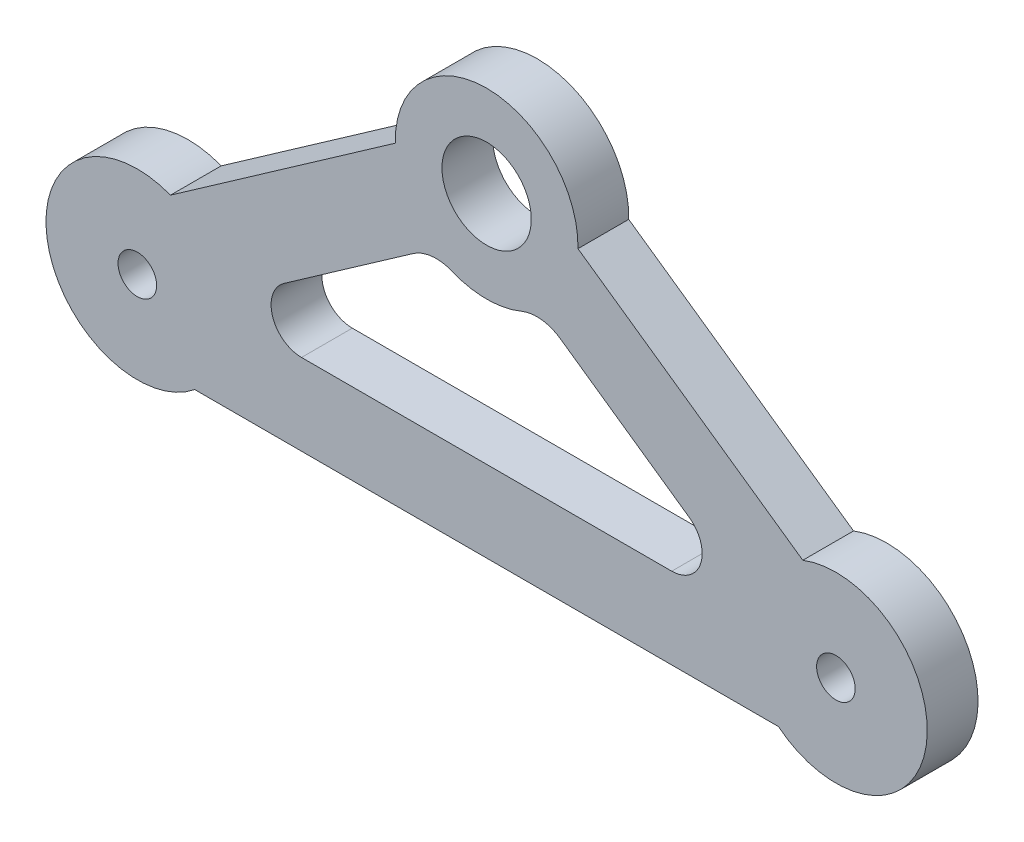
ISO-10303-21;
HEADER;
FILE_DESCRIPTION(('STEP AP214'),'2;1');
FILE_NAME('part.step','',(''),(''),'','','');
FILE_SCHEMA(('AUTOMOTIVE_DESIGN { 1 0 10303 214 1 1 1 1 }'));
ENDSEC;
DATA;
#1=APPLICATION_CONTEXT('core data for automotive mechanical design processes');
#2=APPLICATION_PROTOCOL_DEFINITION('international standard','automotive_design',2000,#1);
#3=PRODUCT_CONTEXT('',#1,'mechanical');
#4=PRODUCT('Part','Part','',(#3));
#5=PRODUCT_RELATED_PRODUCT_CATEGORY('part','',(#4));
#6=PRODUCT_DEFINITION_FORMATION('','',#4);
#7=PRODUCT_DEFINITION_CONTEXT('part definition',#1,'design');
#8=PRODUCT_DEFINITION('design','',#6,#7);
#9=PRODUCT_DEFINITION_SHAPE('','',#8);
#10=(LENGTH_UNIT() NAMED_UNIT(*) SI_UNIT(.MILLI.,.METRE.));
#11=(NAMED_UNIT(*) PLANE_ANGLE_UNIT() SI_UNIT($,.RADIAN.));
#12=(NAMED_UNIT(*) SI_UNIT($,.STERADIAN.) SOLID_ANGLE_UNIT());
#13=UNCERTAINTY_MEASURE_WITH_UNIT(LENGTH_MEASURE(1.E-05),#10,'distance_accuracy_value','');
#14=(GEOMETRIC_REPRESENTATION_CONTEXT(3) GLOBAL_UNCERTAINTY_ASSIGNED_CONTEXT((#13)) GLOBAL_UNIT_ASSIGNED_CONTEXT((#10,
#11,#12)) REPRESENTATION_CONTEXT('',''));
#15=CARTESIAN_POINT('',(0.,0.,0.));
#16=DIRECTION('',(0.,0.,1.));
#17=DIRECTION('',(1.,0.,0.));
#18=AXIS2_PLACEMENT_3D('',#15,#16,#17);
#19=CARTESIAN_POINT('',(34.4043858601376,0.,5.));
#20=DIRECTION('',(0.,0.,1.));
#21=DIRECTION('',(1.,0.,0.));
#22=AXIS2_PLACEMENT_3D('',#19,#20,#21);
#23=PLANE('',#22);
#24=CARTESIAN_POINT('',(34.4043858601376,0.,5.));
#25=DIRECTION('',(0.,0.,-1.));
#26=DIRECTION('',(-1.,0.,0.));
#27=AXIS2_PLACEMENT_3D('',#24,#25,#26);
#28=CIRCLE('',#27,1.89999999999999);
#29=CARTESIAN_POINT('',(32.5043858601376,0.,5.));
#30=VERTEX_POINT('',#29);
#31=EDGE_CURVE('E232',#30,#30,#28,.T.);
#32=ORIENTED_EDGE('',*,*,#31,.T.);
#33=EDGE_LOOP('',(#32));
#34=FACE_BOUND('',#33,.T.);
#35=CARTESIAN_POINT('',(0.,24.090210326744,5.));
#36=DIRECTION('',(0.,0.,-1.));
#37=DIRECTION('',(-1.,0.,0.));
#38=AXIS2_PLACEMENT_3D('',#35,#36,#37);
#39=CIRCLE('',#38,4.4);
#40=CARTESIAN_POINT('',(-4.4,24.090210326744,5.));
#41=VERTEX_POINT('',#40);
#42=EDGE_CURVE('E163',#41,#41,#39,.T.);
#43=ORIENTED_EDGE('',*,*,#42,.T.);
#44=EDGE_LOOP('',(#43));
#45=FACE_BOUND('',#44,.T.);
#46=CARTESIAN_POINT('',(-34.4043858601376,0.,5.));
#47=DIRECTION('',(0.,0.,-1.));
#48=DIRECTION('',(-1.,0.,0.));
#49=AXIS2_PLACEMENT_3D('',#46,#47,#48);
#50=CIRCLE('',#49,9.);
#51=CARTESIAN_POINT('',(-28.7475316106452,-7.,5.));
#52=VERTEX_POINT('',#51);
#53=CARTESIAN_POINT('',(-31.1422954470831,8.38801324134969,5.));
#54=VERTEX_POINT('',#53);
#55=EDGE_CURVE('E170',#52,#54,#50,.T.);
#56=ORIENTED_EDGE('',*,*,#55,.F.);
#57=DIRECTION('',(1.,0.,0.));
#58=VECTOR('',#57,1.);
#59=CARTESIAN_POINT('',(-28.7475316106452,-7.,5.));
#60=LINE('',#59,#58);
#61=CARTESIAN_POINT('',(28.7475316106453,-7.,5.));
#62=VERTEX_POINT('',#61);
#63=EDGE_CURVE('E166',#52,#62,#60,.T.);
#64=ORIENTED_EDGE('',*,*,#63,.T.);
#65=CARTESIAN_POINT('',(34.4043858601376,0.,5.));
#66=DIRECTION('',(0.,0.,-1.));
#67=DIRECTION('',(-1.,0.,0.));
#68=AXIS2_PLACEMENT_3D('',#65,#66,#67);
#69=CIRCLE('',#68,8.99999999999999);
#70=CARTESIAN_POINT('',(31.1422954470831,8.38801324134969,5.));
#71=VERTEX_POINT('',#70);
#72=EDGE_CURVE('E164',#71,#62,#69,.T.);
#73=ORIENTED_EDGE('',*,*,#72,.F.);
#74=DIRECTION('',(0.819152044288991,-0.573576436351047,0.));
#75=VECTOR('',#74,1.);
#76=CARTESIAN_POINT('',(8.99785477656499,23.8937175282842,5.));
#77=LINE('',#76,#75);
#78=CARTESIAN_POINT('',(8.99785477656499,23.8937175282842,5.));
#79=VERTEX_POINT('',#78);
#80=EDGE_CURVE('E136',#71,#79,#77,.F.);
#81=ORIENTED_EDGE('',*,*,#80,.T.);
#82=CARTESIAN_POINT('',(0.,24.090210326744,5.));
#83=DIRECTION('',(0.,0.,-1.));
#84=DIRECTION('',(-1.,0.,0.));
#85=AXIS2_PLACEMENT_3D('',#82,#83,#84);
#86=CIRCLE('',#85,9.00000000000001);
#87=CARTESIAN_POINT('',(-8.997854776565,23.8937175282842,5.));
#88=VERTEX_POINT('',#87);
#89=EDGE_CURVE('E133',#88,#79,#86,.T.);
#90=ORIENTED_EDGE('',*,*,#89,.F.);
#91=DIRECTION('',(0.819152044288991,0.573576436351047,0.));
#92=VECTOR('',#91,1.);
#93=CARTESIAN_POINT('',(-8.99785477656499,23.8937175282842,5.));
#94=LINE('',#93,#92);
#95=EDGE_CURVE('E173',#88,#54,#94,.F.);
#96=ORIENTED_EDGE('',*,*,#95,.T.);
#97=EDGE_LOOP('',(#56,#64,#73,#81,#90,#96));
#98=FACE_BOUND('',#97,.T.);
#99=CARTESIAN_POINT('',(-34.4043858601376,0.,5.));
#100=DIRECTION('',(0.,0.,-1.));
#101=DIRECTION('',(-1.,0.,0.));
#102=AXIS2_PLACEMENT_3D('',#99,#100,#101);
#103=CIRCLE('',#102,1.9);
#104=CARTESIAN_POINT('',(-36.3043858601376,0.,5.));
#105=VERTEX_POINT('',#104);
#106=EDGE_CURVE('E178',#105,#105,#103,.T.);
#107=ORIENTED_EDGE('',*,*,#106,.T.);
#108=EDGE_LOOP('',(#107));
#109=FACE_BOUND('',#108,.T.);
#110=DIRECTION('',(-0.819152044288991,0.573576436351047,0.));
#111=VECTOR('',#110,1.);
#112=CARTESIAN_POINT('',(27.7458974665322,1.,5.));
#113=LINE('',#112,#111);
#114=CARTESIAN_POINT('',(7.25263174461788,15.3495391410191,5.));
#115=VERTEX_POINT('',#114);
#116=CARTESIAN_POINT('',(19.9518423684957,6.45745613286697,5.));
#117=VERTEX_POINT('',#116);
#118=EDGE_CURVE('E203',#115,#117,#113,.F.);
#119=ORIENTED_EDGE('',*,*,#118,.T.);
#120=CARTESIAN_POINT('',(18.2311130594426,4.,5.));
#121=DIRECTION('',(0.,0.,-1.));
#122=DIRECTION('',(-1.,0.,0.));
#123=AXIS2_PLACEMENT_3D('',#120,#121,#122);
#124=CIRCLE('',#123,3.);
#125=CARTESIAN_POINT('',(18.2311130594426,1.,5.));
#126=VERTEX_POINT('',#125);
#127=EDGE_CURVE('E199',#117,#126,#124,.T.);
#128=ORIENTED_EDGE('',*,*,#127,.T.);
#129=DIRECTION('',(1.,0.,0.));
#130=VECTOR('',#129,1.);
#131=CARTESIAN_POINT('',(-27.7458974665322,1.,5.));
#132=LINE('',#131,#130);
#133=CARTESIAN_POINT('',(-18.2311130594426,1.,5.));
#134=VERTEX_POINT('',#133);
#135=EDGE_CURVE('E195',#126,#134,#132,.F.);
#136=ORIENTED_EDGE('',*,*,#135,.T.);
#137=CARTESIAN_POINT('',(-18.2311130594426,4.,5.));
#138=DIRECTION('',(0.,0.,-1.));
#139=DIRECTION('',(-1.,0.,0.));
#140=AXIS2_PLACEMENT_3D('',#137,#138,#139);
#141=CIRCLE('',#140,3.);
#142=CARTESIAN_POINT('',(-19.9518423684958,6.45745613286697,5.));
#143=VERTEX_POINT('',#142);
#144=EDGE_CURVE('E191',#134,#143,#141,.T.);
#145=ORIENTED_EDGE('',*,*,#144,.T.);
#146=DIRECTION('',(-0.819152044288991,-0.573576436351047,0.));
#147=VECTOR('',#146,1.);
#148=CARTESIAN_POINT('',(-5.23000627502169,16.7657967418053,5.));
#149=LINE('',#148,#147);
#150=CARTESIAN_POINT('',(-7.2526317446179,15.3495391410191,5.));
#151=VERTEX_POINT('',#150);
#152=EDGE_CURVE('E187',#143,#151,#149,.F.);
#153=ORIENTED_EDGE('',*,*,#152,.T.);
#154=CARTESIAN_POINT('',(-4.95832599921371,12.0729309638632,5.));
#155=DIRECTION('',(0.,0.,1.));
#156=DIRECTION('',(1.,0.,0.));
#157=AXIS2_PLACEMENT_3D('',#154,#155,#156);
#158=CIRCLE('',#157,4.);
#159=CARTESIAN_POINT('',(-3.43268723022488,15.7705553832111,5.));
#160=VERTEX_POINT('',#159);
#161=EDGE_CURVE('E183',#151,#160,#158,.F.);
#162=ORIENTED_EDGE('',*,*,#161,.T.);
#163=CARTESIAN_POINT('',(0.,24.090210326744,5.));
#164=DIRECTION('',(0.,0.,1.));
#165=DIRECTION('',(1.,0.,0.));
#166=AXIS2_PLACEMENT_3D('',#163,#164,#165);
#167=CIRCLE('',#166,9.00000000000001);
#168=CARTESIAN_POINT('',(3.43268723022486,15.7705553832111,5.));
#169=VERTEX_POINT('',#168);
#170=EDGE_CURVE('E179',#169,#160,#167,.F.);
#171=ORIENTED_EDGE('',*,*,#170,.F.);
#172=CARTESIAN_POINT('',(4.95832599921369,12.0729309638631,5.));
#173=DIRECTION('',(0.,0.,1.));
#174=DIRECTION('',(1.,0.,0.));
#175=AXIS2_PLACEMENT_3D('',#172,#173,#174);
#176=CIRCLE('',#175,4.);
#177=EDGE_CURVE('E20',#169,#115,#176,.F.);
#178=ORIENTED_EDGE('',*,*,#177,.T.);
#179=EDGE_LOOP('',(#119,#128,#136,#145,#153,#162,#171,#178));
#180=FACE_BOUND('',#179,.T.);
#181=ADVANCED_FACE('F17',(#34,#45,#98,#109,#180),#23,.T.);
#182=CARTESIAN_POINT('',(4.95832599921369,12.0729309638631,-2.));
#183=DIRECTION('',(0.,0.,1.));
#184=DIRECTION('',(1.,0.,0.));
#185=AXIS2_PLACEMENT_3D('',#182,#183,#184);
#186=CYLINDRICAL_SURFACE('',#185,4.);
#187=DIRECTION('',(0.,0.,1.));
#188=VECTOR('',#187,1.);
#189=CARTESIAN_POINT('',(7.25263174461788,15.3495391410191,-2.));
#190=LINE('',#189,#188);
#191=CARTESIAN_POINT('',(7.25263174461788,15.3495391410191,0.));
#192=VERTEX_POINT('',#191);
#193=EDGE_CURVE('E204',#192,#115,#190,.T.);
#194=ORIENTED_EDGE('',*,*,#193,.T.);
#195=ORIENTED_EDGE('',*,*,#177,.F.);
#196=DIRECTION('',(0.,0.,1.));
#197=VECTOR('',#196,1.);
#198=CARTESIAN_POINT('',(3.43268723022486,15.7705553832111,-2.));
#199=LINE('',#198,#197);
#200=CARTESIAN_POINT('',(3.43268723022486,15.7705553832111,0.));
#201=VERTEX_POINT('',#200);
#202=EDGE_CURVE('E180',#201,#169,#199,.T.);
#203=ORIENTED_EDGE('',*,*,#202,.F.);
#204=CARTESIAN_POINT('',(4.95832599921369,12.0729309638631,0.));
#205=DIRECTION('',(0.,0.,1.));
#206=DIRECTION('',(1.,0.,0.));
#207=AXIS2_PLACEMENT_3D('',#204,#205,#206);
#208=CIRCLE('',#207,4.);
#209=EDGE_CURVE('E161',#201,#192,#208,.F.);
#210=ORIENTED_EDGE('',*,*,#209,.T.);
#211=EDGE_LOOP('',(#194,#195,#203,#210));
#212=FACE_BOUND('',#211,.T.);
#213=ADVANCED_FACE('F262',(#212),#186,.F.);
#214=CARTESIAN_POINT('',(27.7458974665322,1.,-2.));
#215=DIRECTION('',(0.573576436351047,0.819152044288991,0.));
#216=DIRECTION('',(-0.819152044288991,0.573576436351047,0.));
#217=AXIS2_PLACEMENT_3D('',#214,#215,#216);
#218=PLANE('',#217);
#219=ORIENTED_EDGE('',*,*,#193,.F.);
#220=DIRECTION('',(0.819152044288991,-0.573576436351047,0.));
#221=VECTOR('',#220,1.);
#222=CARTESIAN_POINT('',(7.25263174461788,15.3495391410191,0.));
#223=LINE('',#222,#221);
#224=CARTESIAN_POINT('',(19.9518423684957,6.45745613286698,0.));
#225=VERTEX_POINT('',#224);
#226=EDGE_CURVE('E158',#192,#225,#223,.T.);
#227=ORIENTED_EDGE('',*,*,#226,.T.);
#228=DIRECTION('',(0.,0.,-1.));
#229=VECTOR('',#228,1.);
#230=CARTESIAN_POINT('',(19.9518423684957,6.45745613286697,-2.));
#231=LINE('',#230,#229);
#232=EDGE_CURVE('E200',#225,#117,#231,.F.);
#233=ORIENTED_EDGE('',*,*,#232,.T.);
#234=ORIENTED_EDGE('',*,*,#118,.F.);
#235=EDGE_LOOP('',(#219,#227,#233,#234));
#236=FACE_BOUND('',#235,.T.);
#237=ADVANCED_FACE('F260',(#236),#218,.F.);
#238=CARTESIAN_POINT('',(18.2311130594426,4.,-2.));
#239=DIRECTION('',(0.,0.,-1.));
#240=DIRECTION('',(-1.,0.,0.));
#241=AXIS2_PLACEMENT_3D('',#238,#239,#240);
#242=CYLINDRICAL_SURFACE('',#241,3.);
#243=DIRECTION('',(0.,0.,-1.));
#244=VECTOR('',#243,1.);
#245=CARTESIAN_POINT('',(18.2311130594426,1.,-2.));
#246=LINE('',#245,#244);
#247=CARTESIAN_POINT('',(18.2311130594426,1.,0.));
#248=VERTEX_POINT('',#247);
#249=EDGE_CURVE('E196',#248,#126,#246,.F.);
#250=ORIENTED_EDGE('',*,*,#249,.T.);
#251=ORIENTED_EDGE('',*,*,#127,.F.);
#252=ORIENTED_EDGE('',*,*,#232,.F.);
#253=CARTESIAN_POINT('',(18.2311130594426,4.,0.));
#254=DIRECTION('',(0.,0.,-1.));
#255=DIRECTION('',(-1.,0.,0.));
#256=AXIS2_PLACEMENT_3D('',#253,#254,#255);
#257=CIRCLE('',#256,3.);
#258=EDGE_CURVE('E157',#225,#248,#257,.T.);
#259=ORIENTED_EDGE('',*,*,#258,.T.);
#260=EDGE_LOOP('',(#250,#251,#252,#259));
#261=FACE_BOUND('',#260,.T.);
#262=ADVANCED_FACE('F253',(#261),#242,.F.);
#263=CARTESIAN_POINT('',(-27.7458974665322,1.,-2.));
#264=DIRECTION('',(0.,-1.,0.));
#265=DIRECTION('',(0.,0.,-1.));
#266=AXIS2_PLACEMENT_3D('',#263,#264,#265);
#267=PLANE('',#266);
#268=ORIENTED_EDGE('',*,*,#249,.F.);
#269=DIRECTION('',(1.,0.,0.));
#270=VECTOR('',#269,1.);
#271=CARTESIAN_POINT('',(34.4043858601376,1.,0.));
#272=LINE('',#271,#270);
#273=CARTESIAN_POINT('',(-18.2311130594426,1.,0.));
#274=VERTEX_POINT('',#273);
#275=EDGE_CURVE('E154',#248,#274,#272,.F.);
#276=ORIENTED_EDGE('',*,*,#275,.T.);
#277=DIRECTION('',(0.,0.,-1.));
#278=VECTOR('',#277,1.);
#279=CARTESIAN_POINT('',(-18.2311130594426,1.,-2.));
#280=LINE('',#279,#278);
#281=EDGE_CURVE('E192',#274,#134,#280,.F.);
#282=ORIENTED_EDGE('',*,*,#281,.T.);
#283=ORIENTED_EDGE('',*,*,#135,.F.);
#284=EDGE_LOOP('',(#268,#276,#282,#283));
#285=FACE_BOUND('',#284,.T.);
#286=ADVANCED_FACE('F251',(#285),#267,.F.);
#287=CARTESIAN_POINT('',(-18.2311130594426,4.,-2.));
#288=DIRECTION('',(0.,0.,-1.));
#289=DIRECTION('',(-1.,0.,0.));
#290=AXIS2_PLACEMENT_3D('',#287,#288,#289);
#291=CYLINDRICAL_SURFACE('',#290,3.);
#292=ORIENTED_EDGE('',*,*,#144,.F.);
#293=ORIENTED_EDGE('',*,*,#281,.F.);
#294=CARTESIAN_POINT('',(-18.2311130594426,4.,0.));
#295=DIRECTION('',(0.,0.,-1.));
#296=DIRECTION('',(-1.,0.,0.));
#297=AXIS2_PLACEMENT_3D('',#294,#295,#296);
#298=CIRCLE('',#297,3.);
#299=CARTESIAN_POINT('',(-19.9518423684958,6.45745613286697,0.));
#300=VERTEX_POINT('',#299);
#301=EDGE_CURVE('E153',#274,#300,#298,.T.);
#302=ORIENTED_EDGE('',*,*,#301,.T.);
#303=DIRECTION('',(0.,0.,1.));
#304=VECTOR('',#303,1.);
#305=CARTESIAN_POINT('',(-19.9518423684958,6.45745613286697,-2.));
#306=LINE('',#305,#304);
#307=EDGE_CURVE('E188',#300,#143,#306,.T.);
#308=ORIENTED_EDGE('',*,*,#307,.T.);
#309=EDGE_LOOP('',(#292,#293,#302,#308));
#310=FACE_BOUND('',#309,.T.);
#311=ADVANCED_FACE('F276',(#310),#291,.F.);
#312=CARTESIAN_POINT('',(-5.23000627502169,16.7657967418053,-2.));
#313=DIRECTION('',(-0.573576436351047,0.819152044288991,0.));
#314=DIRECTION('',(-0.819152044288991,-0.573576436351047,0.));
#315=AXIS2_PLACEMENT_3D('',#312,#313,#314);
#316=PLANE('',#315);
#317=DIRECTION('',(0.,0.,1.));
#318=VECTOR('',#317,1.);
#319=CARTESIAN_POINT('',(-7.2526317446179,15.3495391410191,-2.));
#320=LINE('',#319,#318);
#321=CARTESIAN_POINT('',(-7.2526317446179,15.3495391410191,0.));
#322=VERTEX_POINT('',#321);
#323=EDGE_CURVE('E184',#322,#151,#320,.T.);
#324=ORIENTED_EDGE('',*,*,#323,.T.);
#325=ORIENTED_EDGE('',*,*,#152,.F.);
#326=ORIENTED_EDGE('',*,*,#307,.F.);
#327=DIRECTION('',(0.819152044288991,0.573576436351047,0.));
#328=VECTOR('',#327,1.);
#329=CARTESIAN_POINT('',(-19.9518423684958,6.45745613286697,0.));
#330=LINE('',#329,#328);
#331=EDGE_CURVE('E149',#300,#322,#330,.T.);
#332=ORIENTED_EDGE('',*,*,#331,.T.);
#333=EDGE_LOOP('',(#324,#325,#326,#332));
#334=FACE_BOUND('',#333,.T.);
#335=ADVANCED_FACE('F273',(#334),#316,.F.);
#336=CARTESIAN_POINT('',(-4.95832599921371,12.0729309638632,-2.));
#337=DIRECTION('',(0.,0.,1.));
#338=DIRECTION('',(1.,0.,0.));
#339=AXIS2_PLACEMENT_3D('',#336,#337,#338);
#340=CYLINDRICAL_SURFACE('',#339,4.);
#341=DIRECTION('',(0.,0.,1.));
#342=VECTOR('',#341,1.);
#343=CARTESIAN_POINT('',(-3.43268723022488,15.7705553832111,-2.));
#344=LINE('',#343,#342);
#345=CARTESIAN_POINT('',(-3.43268723022488,15.7705553832111,0.));
#346=VERTEX_POINT('',#345);
#347=EDGE_CURVE('E176',#160,#346,#344,.F.);
#348=ORIENTED_EDGE('',*,*,#347,.F.);
#349=ORIENTED_EDGE('',*,*,#161,.F.);
#350=ORIENTED_EDGE('',*,*,#323,.F.);
#351=CARTESIAN_POINT('',(-4.95832599921371,12.0729309638632,0.));
#352=DIRECTION('',(0.,0.,1.));
#353=DIRECTION('',(1.,0.,0.));
#354=AXIS2_PLACEMENT_3D('',#351,#352,#353);
#355=CIRCLE('',#354,4.);
#356=EDGE_CURVE('E152',#322,#346,#355,.F.);
#357=ORIENTED_EDGE('',*,*,#356,.T.);
#358=EDGE_LOOP('',(#348,#349,#350,#357));
#359=FACE_BOUND('',#358,.T.);
#360=ADVANCED_FACE('F269',(#359),#340,.F.);
#361=CARTESIAN_POINT('',(0.,24.090210326744,-2.));
#362=DIRECTION('',(0.,0.,1.));
#363=DIRECTION('',(1.,0.,0.));
#364=AXIS2_PLACEMENT_3D('',#361,#362,#363);
#365=CYLINDRICAL_SURFACE('',#364,9.00000000000001);
#366=ORIENTED_EDGE('',*,*,#170,.T.);
#367=ORIENTED_EDGE('',*,*,#347,.T.);
#368=CARTESIAN_POINT('',(0.,24.090210326744,0.));
#369=DIRECTION('',(0.,0.,1.));
#370=DIRECTION('',(1.,0.,0.));
#371=AXIS2_PLACEMENT_3D('',#368,#369,#370);
#372=CIRCLE('',#371,9.00000000000001);
#373=EDGE_CURVE('E144',#346,#201,#372,.T.);
#374=ORIENTED_EDGE('',*,*,#373,.T.);
#375=ORIENTED_EDGE('',*,*,#202,.T.);
#376=EDGE_LOOP('',(#366,#367,#374,#375));
#377=FACE_BOUND('',#376,.T.);
#378=ADVANCED_FACE('F278',(#377),#365,.T.);
#379=CARTESIAN_POINT('',(-34.4043858601376,0.,5.));
#380=DIRECTION('',(0.,0.,-1.));
#381=DIRECTION('',(-1.,0.,0.));
#382=AXIS2_PLACEMENT_3D('',#379,#380,#381);
#383=CYLINDRICAL_SURFACE('',#382,1.9);
#384=CARTESIAN_POINT('',(-34.4043858601376,0.,0.));
#385=DIRECTION('',(0.,0.,-1.));
#386=DIRECTION('',(-1.,0.,0.));
#387=AXIS2_PLACEMENT_3D('',#384,#385,#386);
#388=CIRCLE('',#387,1.9);
#389=CARTESIAN_POINT('',(-36.3043858601376,0.,0.));
#390=VERTEX_POINT('',#389);
#391=EDGE_CURVE('E141',#390,#390,#388,.T.);
#392=ORIENTED_EDGE('',*,*,#391,.T.);
#393=EDGE_LOOP('',(#392));
#394=FACE_BOUND('',#393,.T.);
#395=ORIENTED_EDGE('',*,*,#106,.F.);
#396=EDGE_LOOP('',(#395));
#397=FACE_BOUND('',#396,.T.);
#398=ADVANCED_FACE('F280',(#394,#397),#383,.F.);
#399=CARTESIAN_POINT('',(8.99785477656499,23.8937175282842,5.));
#400=DIRECTION('',(-0.573576436351047,-0.819152044288991,0.));
#401=DIRECTION('',(0.819152044288991,-0.573576436351047,0.));
#402=AXIS2_PLACEMENT_3D('',#399,#400,#401);
#403=PLANE('',#402);
#404=DIRECTION('',(0.,0.,1.));
#405=VECTOR('',#404,1.);
#406=CARTESIAN_POINT('',(8.99785477656499,23.8937175282842,5.));
#407=LINE('',#406,#405);
#408=CARTESIAN_POINT('',(8.99785477656499,23.8937175282842,0.));
#409=VERTEX_POINT('',#408);
#410=EDGE_CURVE('E131',#79,#409,#407,.F.);
#411=ORIENTED_EDGE('',*,*,#410,.F.);
#412=ORIENTED_EDGE('',*,*,#80,.F.);
#413=DIRECTION('',(0.,0.,-1.));
#414=VECTOR('',#413,1.);
#415=CARTESIAN_POINT('',(31.1422954470831,8.38801324134969,5.));
#416=LINE('',#415,#414);
#417=CARTESIAN_POINT('',(31.1422954470831,8.38801324134969,0.));
#418=VERTEX_POINT('',#417);
#419=EDGE_CURVE('E140',#418,#71,#416,.F.);
#420=ORIENTED_EDGE('',*,*,#419,.F.);
#421=DIRECTION('',(-0.819152044288991,0.573576436351047,0.));
#422=VECTOR('',#421,1.);
#423=CARTESIAN_POINT('',(31.1422954470831,8.38801324134969,0.));
#424=LINE('',#423,#422);
#425=EDGE_CURVE('E124',#418,#409,#424,.T.);
#426=ORIENTED_EDGE('',*,*,#425,.T.);
#427=EDGE_LOOP('',(#411,#412,#420,#426));
#428=FACE_BOUND('',#427,.T.);
#429=ADVANCED_FACE('F138',(#428),#403,.F.);
#430=CARTESIAN_POINT('',(0.,24.090210326744,5.));
#431=DIRECTION('',(0.,0.,-1.));
#432=DIRECTION('',(-1.,0.,0.));
#433=AXIS2_PLACEMENT_3D('',#430,#431,#432);
#434=CYLINDRICAL_SURFACE('',#433,9.00000000000001);
#435=CARTESIAN_POINT('',(0.,24.090210326744,0.));
#436=DIRECTION('',(0.,0.,-1.));
#437=DIRECTION('',(-1.,0.,0.));
#438=AXIS2_PLACEMENT_3D('',#435,#436,#437);
#439=CIRCLE('',#438,9.00000000000001);
#440=CARTESIAN_POINT('',(-8.997854776565,23.8937175282842,0.));
#441=VERTEX_POINT('',#440);
#442=EDGE_CURVE('E116',#409,#441,#439,.F.);
#443=ORIENTED_EDGE('',*,*,#442,.T.);
#444=DIRECTION('',(0.,0.,1.));
#445=VECTOR('',#444,1.);
#446=CARTESIAN_POINT('',(-8.99785477656499,23.8937175282842,5.));
#447=LINE('',#446,#445);
#448=EDGE_CURVE('E174',#441,#88,#447,.T.);
#449=ORIENTED_EDGE('',*,*,#448,.T.);
#450=ORIENTED_EDGE('',*,*,#89,.T.);
#451=ORIENTED_EDGE('',*,*,#410,.T.);
#452=EDGE_LOOP('',(#443,#449,#450,#451));
#453=FACE_BOUND('',#452,.T.);
#454=ADVANCED_FACE('F132',(#453),#434,.T.);
#455=CARTESIAN_POINT('',(-8.99785477656499,23.8937175282842,5.));
#456=DIRECTION('',(0.573576436351047,-0.819152044288991,0.));
#457=DIRECTION('',(0.819152044288991,0.573576436351047,0.));
#458=AXIS2_PLACEMENT_3D('',#455,#456,#457);
#459=PLANE('',#458);
#460=DIRECTION('',(0.,0.,-1.));
#461=VECTOR('',#460,1.);
#462=CARTESIAN_POINT('',(-31.1422954470831,8.38801324134969,5.));
#463=LINE('',#462,#461);
#464=CARTESIAN_POINT('',(-31.1422954470831,8.38801324134969,0.));
#465=VERTEX_POINT('',#464);
#466=EDGE_CURVE('E171',#54,#465,#463,.T.);
#467=ORIENTED_EDGE('',*,*,#466,.F.);
#468=ORIENTED_EDGE('',*,*,#95,.F.);
#469=ORIENTED_EDGE('',*,*,#448,.F.);
#470=DIRECTION('',(-0.819152044288991,-0.573576436351047,0.));
#471=VECTOR('',#470,1.);
#472=CARTESIAN_POINT('',(-8.99785477656499,23.8937175282842,0.));
#473=LINE('',#472,#471);
#474=EDGE_CURVE('E128',#441,#465,#473,.T.);
#475=ORIENTED_EDGE('',*,*,#474,.T.);
#476=EDGE_LOOP('',(#467,#468,#469,#475));
#477=FACE_BOUND('',#476,.T.);
#478=ADVANCED_FACE('F316',(#477),#459,.F.);
#479=CARTESIAN_POINT('',(-34.4043858601376,0.,5.));
#480=DIRECTION('',(0.,0.,-1.));
#481=DIRECTION('',(-1.,0.,0.));
#482=AXIS2_PLACEMENT_3D('',#479,#480,#481);
#483=CYLINDRICAL_SURFACE('',#482,9.);
#484=CARTESIAN_POINT('',(-34.4043858601376,0.,0.));
#485=DIRECTION('',(0.,0.,-1.));
#486=DIRECTION('',(-1.,0.,0.));
#487=AXIS2_PLACEMENT_3D('',#484,#485,#486);
#488=CIRCLE('',#487,9.);
#489=CARTESIAN_POINT('',(-28.7475316106452,-7.,0.));
#490=VERTEX_POINT('',#489);
#491=EDGE_CURVE('E221',#465,#490,#488,.F.);
#492=ORIENTED_EDGE('',*,*,#491,.T.);
#493=DIRECTION('',(0.,0.,1.));
#494=VECTOR('',#493,1.);
#495=CARTESIAN_POINT('',(-28.7475316106452,-7.,5.));
#496=LINE('',#495,#494);
#497=EDGE_CURVE('E167',#490,#52,#496,.T.);
#498=ORIENTED_EDGE('',*,*,#497,.T.);
#499=ORIENTED_EDGE('',*,*,#55,.T.);
#500=ORIENTED_EDGE('',*,*,#466,.T.);
#501=EDGE_LOOP('',(#492,#498,#499,#500));
#502=FACE_BOUND('',#501,.T.);
#503=ADVANCED_FACE('F312',(#502),#483,.T.);
#504=CARTESIAN_POINT('',(-28.7475316106452,-7.,5.));
#505=DIRECTION('',(0.,1.,0.));
#506=DIRECTION('',(0.,0.,1.));
#507=AXIS2_PLACEMENT_3D('',#504,#505,#506);
#508=PLANE('',#507);
#509=DIRECTION('',(0.,0.,-1.));
#510=VECTOR('',#509,1.);
#511=CARTESIAN_POINT('',(28.7475316106453,-7.,5.));
#512=LINE('',#511,#510);
#513=CARTESIAN_POINT('',(28.7475316106453,-7.,0.));
#514=VERTEX_POINT('',#513);
#515=EDGE_CURVE('E35',#62,#514,#512,.T.);
#516=ORIENTED_EDGE('',*,*,#515,.F.);
#517=ORIENTED_EDGE('',*,*,#63,.F.);
#518=ORIENTED_EDGE('',*,*,#497,.F.);
#519=DIRECTION('',(1.,0.,0.));
#520=VECTOR('',#519,1.);
#521=CARTESIAN_POINT('',(34.4043858601376,-7.,0.));
#522=LINE('',#521,#520);
#523=EDGE_CURVE('E220',#490,#514,#522,.T.);
#524=ORIENTED_EDGE('',*,*,#523,.T.);
#525=EDGE_LOOP('',(#516,#517,#518,#524));
#526=FACE_BOUND('',#525,.T.);
#527=ADVANCED_FACE('F309',(#526),#508,.F.);
#528=CARTESIAN_POINT('',(34.4043858601376,0.,5.));
#529=DIRECTION('',(0.,0.,-1.));
#530=DIRECTION('',(-1.,0.,0.));
#531=AXIS2_PLACEMENT_3D('',#528,#529,#530);
#532=CYLINDRICAL_SURFACE('',#531,8.99999999999999);
#533=ORIENTED_EDGE('',*,*,#72,.T.);
#534=ORIENTED_EDGE('',*,*,#515,.T.);
#535=CARTESIAN_POINT('',(34.4043858601376,0.,0.));
#536=DIRECTION('',(0.,0.,-1.));
#537=DIRECTION('',(-1.,0.,0.));
#538=AXIS2_PLACEMENT_3D('',#535,#536,#537);
#539=CIRCLE('',#538,8.99999999999999);
#540=EDGE_CURVE('E218',#514,#418,#539,.F.);
#541=ORIENTED_EDGE('',*,*,#540,.T.);
#542=ORIENTED_EDGE('',*,*,#419,.T.);
#543=EDGE_LOOP('',(#533,#534,#541,#542));
#544=FACE_BOUND('',#543,.T.);
#545=ADVANCED_FACE('F305',(#544),#532,.T.);
#546=CARTESIAN_POINT('',(0.,24.090210326744,5.));
#547=DIRECTION('',(0.,0.,-1.));
#548=DIRECTION('',(-1.,0.,0.));
#549=AXIS2_PLACEMENT_3D('',#546,#547,#548);
#550=CYLINDRICAL_SURFACE('',#549,4.4);
#551=CARTESIAN_POINT('',(0.,24.090210326744,0.));
#552=DIRECTION('',(0.,0.,-1.));
#553=DIRECTION('',(-1.,0.,0.));
#554=AXIS2_PLACEMENT_3D('',#551,#552,#553);
#555=CIRCLE('',#554,4.4);
#556=CARTESIAN_POINT('',(-4.4,24.090210326744,0.));
#557=VERTEX_POINT('',#556);
#558=EDGE_CURVE('E26',#557,#557,#555,.T.);
#559=ORIENTED_EDGE('',*,*,#558,.T.);
#560=EDGE_LOOP('',(#559));
#561=FACE_BOUND('',#560,.T.);
#562=ORIENTED_EDGE('',*,*,#42,.F.);
#563=EDGE_LOOP('',(#562));
#564=FACE_BOUND('',#563,.T.);
#565=ADVANCED_FACE('F297',(#561,#564),#550,.F.);
#566=CARTESIAN_POINT('',(34.4043858601376,0.,5.));
#567=DIRECTION('',(0.,0.,-1.));
#568=DIRECTION('',(-1.,0.,0.));
#569=AXIS2_PLACEMENT_3D('',#566,#567,#568);
#570=CYLINDRICAL_SURFACE('',#569,1.89999999999999);
#571=CARTESIAN_POINT('',(34.4043858601376,0.,0.));
#572=DIRECTION('',(0.,0.,-1.));
#573=DIRECTION('',(-1.,0.,0.));
#574=AXIS2_PLACEMENT_3D('',#571,#572,#573);
#575=CIRCLE('',#574,1.89999999999999);
#576=CARTESIAN_POINT('',(32.5043858601376,0.,0.));
#577=VERTEX_POINT('',#576);
#578=EDGE_CURVE('E11',#577,#577,#575,.T.);
#579=ORIENTED_EDGE('',*,*,#578,.T.);
#580=EDGE_LOOP('',(#579));
#581=FACE_BOUND('',#580,.T.);
#582=ORIENTED_EDGE('',*,*,#31,.F.);
#583=EDGE_LOOP('',(#582));
#584=FACE_BOUND('',#583,.T.);
#585=ADVANCED_FACE('F291',(#581,#584),#570,.F.);
#586=CARTESIAN_POINT('',(34.4043858601376,0.,0.));
#587=DIRECTION('',(0.,0.,1.));
#588=DIRECTION('',(1.,0.,0.));
#589=AXIS2_PLACEMENT_3D('',#586,#587,#588);
#590=PLANE('',#589);
#591=ORIENTED_EDGE('',*,*,#578,.F.);
#592=EDGE_LOOP('',(#591));
#593=FACE_BOUND('',#592,.T.);
#594=ORIENTED_EDGE('',*,*,#558,.F.);
#595=EDGE_LOOP('',(#594));
#596=FACE_BOUND('',#595,.T.);
#597=ORIENTED_EDGE('',*,*,#523,.F.);
#598=ORIENTED_EDGE('',*,*,#491,.F.);
#599=ORIENTED_EDGE('',*,*,#474,.F.);
#600=ORIENTED_EDGE('',*,*,#442,.F.);
#601=ORIENTED_EDGE('',*,*,#425,.F.);
#602=ORIENTED_EDGE('',*,*,#540,.F.);
#603=EDGE_LOOP('',(#597,#598,#599,#600,#601,#602));
#604=FACE_BOUND('',#603,.T.);
#605=ORIENTED_EDGE('',*,*,#391,.F.);
#606=EDGE_LOOP('',(#605));
#607=FACE_BOUND('',#606,.T.);
#608=ORIENTED_EDGE('',*,*,#356,.F.);
#609=ORIENTED_EDGE('',*,*,#331,.F.);
#610=ORIENTED_EDGE('',*,*,#301,.F.);
#611=ORIENTED_EDGE('',*,*,#275,.F.);
#612=ORIENTED_EDGE('',*,*,#258,.F.);
#613=ORIENTED_EDGE('',*,*,#226,.F.);
#614=ORIENTED_EDGE('',*,*,#209,.F.);
#615=ORIENTED_EDGE('',*,*,#373,.F.);
#616=EDGE_LOOP('',(#608,#609,#610,#611,#612,#613,#614,#615));
#617=FACE_BOUND('',#616,.T.);
#618=ADVANCED_FACE('F121',(#593,#596,#604,#607,#617),#590,.F.);
#619=CLOSED_SHELL('',(#181,#213,#237,#262,#286,#311,#335,#360,#378,#398,#429,#454,#478,#503,
#527,#545,#565,#585,#618));
#620=MANIFOLD_SOLID_BREP('B1',#619);
#621=ADVANCED_BREP_SHAPE_REPRESENTATION('',(#18,#620),#14);
#622=SHAPE_DEFINITION_REPRESENTATION(#9,#621);
ENDSEC;
END-ISO-10303-21;
